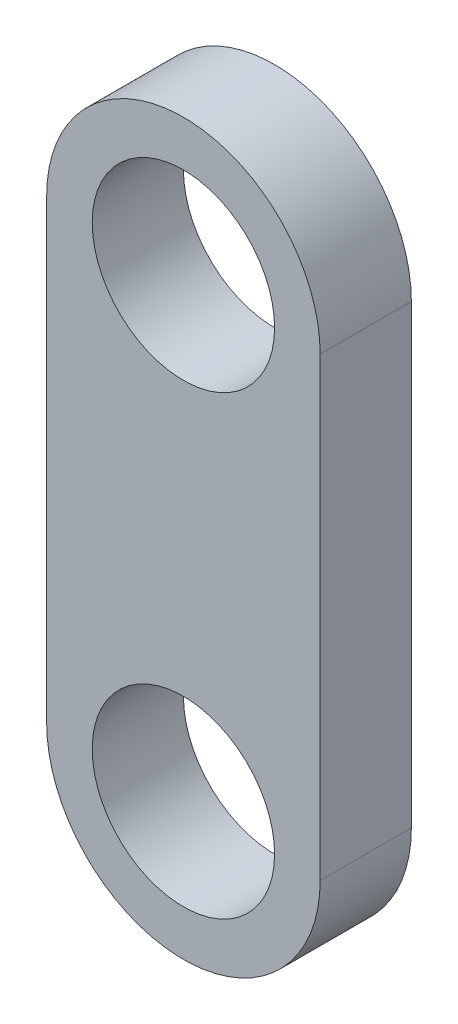
ISO-10303-21;
HEADER;
FILE_DESCRIPTION(('STEP AP214'),'2;1');
FILE_NAME('part.step','',(''),(''),'','','');
FILE_SCHEMA(('AUTOMOTIVE_DESIGN { 1 0 10303 214 1 1 1 1 }'));
ENDSEC;
DATA;
#1=APPLICATION_CONTEXT('core data for automotive mechanical design processes');
#2=APPLICATION_PROTOCOL_DEFINITION('international standard','automotive_design',2000,#1);
#3=PRODUCT_CONTEXT('',#1,'mechanical');
#4=PRODUCT('Part','Part','',(#3));
#5=PRODUCT_RELATED_PRODUCT_CATEGORY('part','',(#4));
#6=PRODUCT_DEFINITION_FORMATION('','',#4);
#7=PRODUCT_DEFINITION_CONTEXT('part definition',#1,'design');
#8=PRODUCT_DEFINITION('design','',#6,#7);
#9=PRODUCT_DEFINITION_SHAPE('','',#8);
#10=(LENGTH_UNIT() NAMED_UNIT(*) SI_UNIT(.MILLI.,.METRE.));
#11=(NAMED_UNIT(*) PLANE_ANGLE_UNIT() SI_UNIT($,.RADIAN.));
#12=(NAMED_UNIT(*) SI_UNIT($,.STERADIAN.) SOLID_ANGLE_UNIT());
#13=UNCERTAINTY_MEASURE_WITH_UNIT(LENGTH_MEASURE(1.E-05),#10,'distance_accuracy_value','');
#14=(GEOMETRIC_REPRESENTATION_CONTEXT(3) GLOBAL_UNCERTAINTY_ASSIGNED_CONTEXT((#13)) GLOBAL_UNIT_ASSIGNED_CONTEXT((#10,
#11,#12)) REPRESENTATION_CONTEXT('',''));
#15=CARTESIAN_POINT('',(0.,0.,0.));
#16=DIRECTION('',(0.,0.,1.));
#17=DIRECTION('',(1.,0.,0.));
#18=AXIS2_PLACEMENT_3D('',#15,#16,#17);
#19=CARTESIAN_POINT('',(0.,-5.,2.));
#20=DIRECTION('',(0.,0.,1.));
#21=DIRECTION('',(1.,0.,0.));
#22=AXIS2_PLACEMENT_3D('',#19,#20,#21);
#23=PLANE('',#22);
#24=CARTESIAN_POINT('',(0.,5.,2.));
#25=DIRECTION('',(0.,0.,1.));
#26=DIRECTION('',(1.,0.,0.));
#27=AXIS2_PLACEMENT_3D('',#24,#25,#26);
#28=CIRCLE('',#27,2.);
#29=CARTESIAN_POINT('',(2.,5.,2.));
#30=VERTEX_POINT('',#29);
#31=EDGE_CURVE('E102',#30,#30,#28,.T.);
#32=ORIENTED_EDGE('',*,*,#31,.F.);
#33=EDGE_LOOP('',(#32));
#34=FACE_BOUND('',#33,.T.);
#35=CARTESIAN_POINT('',(0.,-5.,2.));
#36=DIRECTION('',(0.,0.,1.));
#37=DIRECTION('',(1.,0.,0.));
#38=AXIS2_PLACEMENT_3D('',#35,#36,#37);
#39=CIRCLE('',#38,3.);
#40=CARTESIAN_POINT('',(-3.,-5.,2.));
#41=VERTEX_POINT('',#40);
#42=CARTESIAN_POINT('',(3.,-5.,2.));
#43=VERTEX_POINT('',#42);
#44=EDGE_CURVE('E87',#41,#43,#39,.T.);
#45=ORIENTED_EDGE('',*,*,#44,.T.);
#46=DIRECTION('',(0.,1.,0.));
#47=VECTOR('',#46,1.);
#48=CARTESIAN_POINT('',(3.,5.,2.));
#49=LINE('',#48,#47);
#50=CARTESIAN_POINT('',(3.,5.,2.));
#51=VERTEX_POINT('',#50);
#52=EDGE_CURVE('E82',#43,#51,#49,.T.);
#53=ORIENTED_EDGE('',*,*,#52,.T.);
#54=CARTESIAN_POINT('',(0.,5.,2.));
#55=DIRECTION('',(0.,0.,1.));
#56=DIRECTION('',(1.,0.,0.));
#57=AXIS2_PLACEMENT_3D('',#54,#55,#56);
#58=CIRCLE('',#57,3.);
#59=CARTESIAN_POINT('',(-3.,5.,2.));
#60=VERTEX_POINT('',#59);
#61=EDGE_CURVE('E85',#51,#60,#58,.T.);
#62=ORIENTED_EDGE('',*,*,#61,.T.);
#63=DIRECTION('',(0.,-1.,0.));
#64=VECTOR('',#63,1.);
#65=CARTESIAN_POINT('',(-3.,5.,2.));
#66=LINE('',#65,#64);
#67=EDGE_CURVE('E52',#60,#41,#66,.T.);
#68=ORIENTED_EDGE('',*,*,#67,.T.);
#69=EDGE_LOOP('',(#45,#53,#62,#68));
#70=FACE_BOUND('',#69,.T.);
#71=CARTESIAN_POINT('',(0.,-5.,2.));
#72=DIRECTION('',(0.,0.,1.));
#73=DIRECTION('',(1.,0.,0.));
#74=AXIS2_PLACEMENT_3D('',#71,#72,#73);
#75=CIRCLE('',#74,2.);
#76=CARTESIAN_POINT('',(2.,-5.,2.));
#77=VERTEX_POINT('',#76);
#78=EDGE_CURVE('E117',#77,#77,#75,.T.);
#79=ORIENTED_EDGE('',*,*,#78,.F.);
#80=EDGE_LOOP('',(#79));
#81=FACE_BOUND('',#80,.T.);
#82=ADVANCED_FACE('F35',(#34,#70,#81),#23,.T.);
#83=CARTESIAN_POINT('',(0.,-5.,0.));
#84=DIRECTION('',(0.,0.,1.));
#85=DIRECTION('',(1.,0.,0.));
#86=AXIS2_PLACEMENT_3D('',#83,#84,#85);
#87=PLANE('',#86);
#88=CARTESIAN_POINT('',(0.,-5.,0.));
#89=DIRECTION('',(0.,0.,1.));
#90=DIRECTION('',(1.,0.,0.));
#91=AXIS2_PLACEMENT_3D('',#88,#89,#90);
#92=CIRCLE('',#91,3.);
#93=CARTESIAN_POINT('',(-3.,-5.,0.));
#94=VERTEX_POINT('',#93);
#95=CARTESIAN_POINT('',(3.,-5.,0.));
#96=VERTEX_POINT('',#95);
#97=EDGE_CURVE('E99',#94,#96,#92,.T.);
#98=ORIENTED_EDGE('',*,*,#97,.F.);
#99=DIRECTION('',(0.,-1.,0.));
#100=VECTOR('',#99,1.);
#101=CARTESIAN_POINT('',(-3.,5.,0.));
#102=LINE('',#101,#100);
#103=CARTESIAN_POINT('',(-3.,5.,0.));
#104=VERTEX_POINT('',#103);
#105=EDGE_CURVE('E75',#104,#94,#102,.T.);
#106=ORIENTED_EDGE('',*,*,#105,.F.);
#107=CARTESIAN_POINT('',(0.,5.,0.));
#108=DIRECTION('',(0.,0.,1.));
#109=DIRECTION('',(1.,0.,0.));
#110=AXIS2_PLACEMENT_3D('',#107,#108,#109);
#111=CIRCLE('',#110,3.);
#112=CARTESIAN_POINT('',(3.,5.,0.));
#113=VERTEX_POINT('',#112);
#114=EDGE_CURVE('E69',#113,#104,#111,.T.);
#115=ORIENTED_EDGE('',*,*,#114,.F.);
#116=DIRECTION('',(0.,1.,0.));
#117=VECTOR('',#116,1.);
#118=CARTESIAN_POINT('',(3.,5.,0.));
#119=LINE('',#118,#117);
#120=EDGE_CURVE('E91',#96,#113,#119,.T.);
#121=ORIENTED_EDGE('',*,*,#120,.F.);
#122=EDGE_LOOP('',(#98,#106,#115,#121));
#123=FACE_BOUND('',#122,.T.);
#124=CARTESIAN_POINT('',(0.,5.,0.));
#125=DIRECTION('',(0.,0.,1.));
#126=DIRECTION('',(1.,0.,0.));
#127=AXIS2_PLACEMENT_3D('',#124,#125,#126);
#128=CIRCLE('',#127,2.);
#129=CARTESIAN_POINT('',(2.,5.,0.));
#130=VERTEX_POINT('',#129);
#131=EDGE_CURVE('E114',#130,#130,#128,.T.);
#132=ORIENTED_EDGE('',*,*,#131,.T.);
#133=EDGE_LOOP('',(#132));
#134=FACE_BOUND('',#133,.T.);
#135=CARTESIAN_POINT('',(0.,-5.,0.));
#136=DIRECTION('',(0.,0.,1.));
#137=DIRECTION('',(1.,0.,0.));
#138=AXIS2_PLACEMENT_3D('',#135,#136,#137);
#139=CIRCLE('',#138,2.);
#140=CARTESIAN_POINT('',(2.,-5.,0.));
#141=VERTEX_POINT('',#140);
#142=EDGE_CURVE('E120',#141,#141,#139,.T.);
#143=ORIENTED_EDGE('',*,*,#142,.T.);
#144=EDGE_LOOP('',(#143));
#145=FACE_BOUND('',#144,.T.);
#146=ADVANCED_FACE('F110',(#123,#134,#145),#87,.F.);
#147=CARTESIAN_POINT('',(0.,-5.,2.));
#148=DIRECTION('',(0.,0.,-1.));
#149=DIRECTION('',(-1.,0.,0.));
#150=AXIS2_PLACEMENT_3D('',#147,#148,#149);
#151=CYLINDRICAL_SURFACE('',#150,3.);
#152=ORIENTED_EDGE('',*,*,#97,.T.);
#153=DIRECTION('',(0.,0.,-1.));
#154=VECTOR('',#153,1.);
#155=CARTESIAN_POINT('',(3.,-5.,2.));
#156=LINE('',#155,#154);
#157=EDGE_CURVE('E11',#43,#96,#156,.T.);
#158=ORIENTED_EDGE('',*,*,#157,.F.);
#159=ORIENTED_EDGE('',*,*,#44,.F.);
#160=DIRECTION('',(0.,0.,-1.));
#161=VECTOR('',#160,1.);
#162=CARTESIAN_POINT('',(-3.,-5.,2.));
#163=LINE('',#162,#161);
#164=EDGE_CURVE('E95',#41,#94,#163,.T.);
#165=ORIENTED_EDGE('',*,*,#164,.T.);
#166=EDGE_LOOP('',(#152,#158,#159,#165));
#167=FACE_BOUND('',#166,.T.);
#168=ADVANCED_FACE('F37',(#167),#151,.T.);
#169=CARTESIAN_POINT('',(3.,5.,2.));
#170=DIRECTION('',(-1.,0.,0.));
#171=DIRECTION('',(0.,-1.,0.));
#172=AXIS2_PLACEMENT_3D('',#169,#170,#171);
#173=PLANE('',#172);
#174=ORIENTED_EDGE('',*,*,#120,.T.);
#175=DIRECTION('',(0.,0.,-1.));
#176=VECTOR('',#175,1.);
#177=CARTESIAN_POINT('',(3.,5.,2.));
#178=LINE('',#177,#176);
#179=EDGE_CURVE('E44',#51,#113,#178,.T.);
#180=ORIENTED_EDGE('',*,*,#179,.F.);
#181=ORIENTED_EDGE('',*,*,#52,.F.);
#182=ORIENTED_EDGE('',*,*,#157,.T.);
#183=EDGE_LOOP('',(#174,#180,#181,#182));
#184=FACE_BOUND('',#183,.T.);
#185=ADVANCED_FACE('F90',(#184),#173,.F.);
#186=CARTESIAN_POINT('',(0.,5.,2.));
#187=DIRECTION('',(0.,0.,-1.));
#188=DIRECTION('',(-1.,0.,0.));
#189=AXIS2_PLACEMENT_3D('',#186,#187,#188);
#190=CYLINDRICAL_SURFACE('',#189,3.);
#191=ORIENTED_EDGE('',*,*,#114,.T.);
#192=DIRECTION('',(0.,0.,-1.));
#193=VECTOR('',#192,1.);
#194=CARTESIAN_POINT('',(-3.,5.,2.));
#195=LINE('',#194,#193);
#196=EDGE_CURVE('E92',#60,#104,#195,.T.);
#197=ORIENTED_EDGE('',*,*,#196,.F.);
#198=ORIENTED_EDGE('',*,*,#61,.F.);
#199=ORIENTED_EDGE('',*,*,#179,.T.);
#200=EDGE_LOOP('',(#191,#197,#198,#199));
#201=FACE_BOUND('',#200,.T.);
#202=ADVANCED_FACE('F93',(#201),#190,.T.);
#203=CARTESIAN_POINT('',(-3.,5.,2.));
#204=DIRECTION('',(1.,0.,0.));
#205=DIRECTION('',(0.,1.,0.));
#206=AXIS2_PLACEMENT_3D('',#203,#204,#205);
#207=PLANE('',#206);
#208=ORIENTED_EDGE('',*,*,#105,.T.);
#209=ORIENTED_EDGE('',*,*,#164,.F.);
#210=ORIENTED_EDGE('',*,*,#67,.F.);
#211=ORIENTED_EDGE('',*,*,#196,.T.);
#212=EDGE_LOOP('',(#208,#209,#210,#211));
#213=FACE_BOUND('',#212,.T.);
#214=ADVANCED_FACE('F107',(#213),#207,.F.);
#215=CARTESIAN_POINT('',(0.,5.,2.));
#216=DIRECTION('',(0.,0.,-1.));
#217=DIRECTION('',(-1.,0.,0.));
#218=AXIS2_PLACEMENT_3D('',#215,#216,#217);
#219=CYLINDRICAL_SURFACE('',#218,2.);
#220=ORIENTED_EDGE('',*,*,#31,.T.);
#221=EDGE_LOOP('',(#220));
#222=FACE_BOUND('',#221,.T.);
#223=ORIENTED_EDGE('',*,*,#131,.F.);
#224=EDGE_LOOP('',(#223));
#225=FACE_BOUND('',#224,.T.);
#226=ADVANCED_FACE('F137',(#222,#225),#219,.F.);
#227=CARTESIAN_POINT('',(0.,-5.,2.));
#228=DIRECTION('',(0.,0.,-1.));
#229=DIRECTION('',(-1.,0.,0.));
#230=AXIS2_PLACEMENT_3D('',#227,#228,#229);
#231=CYLINDRICAL_SURFACE('',#230,2.);
#232=ORIENTED_EDGE('',*,*,#78,.T.);
#233=EDGE_LOOP('',(#232));
#234=FACE_BOUND('',#233,.T.);
#235=ORIENTED_EDGE('',*,*,#142,.F.);
#236=EDGE_LOOP('',(#235));
#237=FACE_BOUND('',#236,.T.);
#238=ADVANCED_FACE('F126',(#234,#237),#231,.F.);
#239=CLOSED_SHELL('',(#82,#146,#168,#185,#202,#214,#226,#238));
#240=MANIFOLD_SOLID_BREP('B2',#239);
#241=ADVANCED_BREP_SHAPE_REPRESENTATION('',(#18,#240),#14);
#242=SHAPE_DEFINITION_REPRESENTATION(#9,#241);
ENDSEC;
END-ISO-10303-21;
